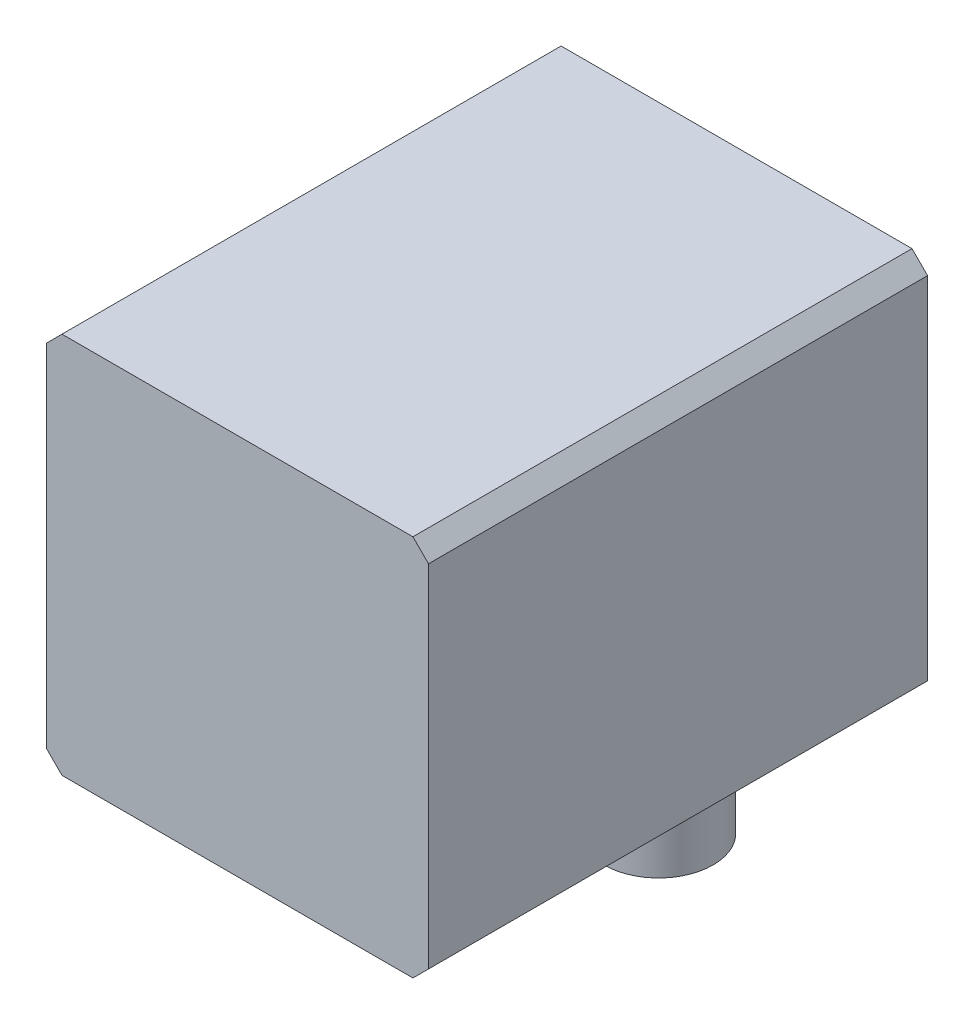
ISO-10303-21;
HEADER;
FILE_DESCRIPTION(('STEP AP214'),'2;1');
FILE_NAME('part.step','',(''),(''),'','','');
FILE_SCHEMA(('AUTOMOTIVE_DESIGN { 1 0 10303 214 1 1 1 1 }'));
ENDSEC;
DATA;
#1=APPLICATION_CONTEXT('core data for automotive mechanical design processes');
#2=APPLICATION_PROTOCOL_DEFINITION('international standard','automotive_design',2000,#1);
#3=PRODUCT_CONTEXT('',#1,'mechanical');
#4=PRODUCT('Part','Part','',(#3));
#5=PRODUCT_RELATED_PRODUCT_CATEGORY('part','',(#4));
#6=PRODUCT_DEFINITION_FORMATION('','',#4);
#7=PRODUCT_DEFINITION_CONTEXT('part definition',#1,'design');
#8=PRODUCT_DEFINITION('design','',#6,#7);
#9=PRODUCT_DEFINITION_SHAPE('','',#8);
#10=(LENGTH_UNIT() NAMED_UNIT(*) SI_UNIT(.MILLI.,.METRE.));
#11=(NAMED_UNIT(*) PLANE_ANGLE_UNIT() SI_UNIT($,.RADIAN.));
#12=(NAMED_UNIT(*) SI_UNIT($,.STERADIAN.) SOLID_ANGLE_UNIT());
#13=UNCERTAINTY_MEASURE_WITH_UNIT(LENGTH_MEASURE(1.E-05),#10,'distance_accuracy_value','');
#14=(GEOMETRIC_REPRESENTATION_CONTEXT(3) GLOBAL_UNCERTAINTY_ASSIGNED_CONTEXT((#13)) GLOBAL_UNIT_ASSIGNED_CONTEXT((#10,
#11,#12)) REPRESENTATION_CONTEXT('',''));
#15=CARTESIAN_POINT('',(0.,0.,0.));
#16=DIRECTION('',(0.,0.,1.));
#17=DIRECTION('',(1.,0.,0.));
#18=AXIS2_PLACEMENT_3D('',#15,#16,#17);
#19=CARTESIAN_POINT('',(-61.25,61.25,160.));
#20=DIRECTION('',(1.,0.,0.));
#21=DIRECTION('',(0.,1.,0.));
#22=AXIS2_PLACEMENT_3D('',#19,#20,#21);
#23=PLANE('',#22);
#24=DIRECTION('',(0.,-1.,0.));
#25=VECTOR('',#24,1.);
#26=CARTESIAN_POINT('',(-61.25,61.25,160.));
#27=LINE('',#26,#25);
#28=CARTESIAN_POINT('',(-61.25,56.25,160.));
#29=VERTEX_POINT('',#28);
#30=CARTESIAN_POINT('',(-61.25,-56.25,160.));
#31=VERTEX_POINT('',#30);
#32=EDGE_CURVE('E132',#29,#31,#27,.T.);
#33=ORIENTED_EDGE('',*,*,#32,.F.);
#34=DIRECTION('',(0.,0.,-1.));
#35=VECTOR('',#34,1.);
#36=CARTESIAN_POINT('',(-61.25,56.25,160.));
#37=LINE('',#36,#35);
#38=CARTESIAN_POINT('',(-61.25,56.25,0.));
#39=VERTEX_POINT('',#38);
#40=EDGE_CURVE('E11',#29,#39,#37,.T.);
#41=ORIENTED_EDGE('',*,*,#40,.T.);
#42=DIRECTION('',(0.,-1.,0.));
#43=VECTOR('',#42,1.);
#44=CARTESIAN_POINT('',(-61.25,61.25,0.));
#45=LINE('',#44,#43);
#46=CARTESIAN_POINT('',(-61.25,-56.25,0.));
#47=VERTEX_POINT('',#46);
#48=EDGE_CURVE('E167',#39,#47,#45,.T.);
#49=ORIENTED_EDGE('',*,*,#48,.T.);
#50=DIRECTION('',(0.,0.,1.));
#51=VECTOR('',#50,1.);
#52=CARTESIAN_POINT('',(-61.25,-56.25,160.));
#53=LINE('',#52,#51);
#54=EDGE_CURVE('E46',#47,#31,#53,.T.);
#55=ORIENTED_EDGE('',*,*,#54,.T.);
#56=EDGE_LOOP('',(#33,#41,#49,#55));
#57=FACE_BOUND('',#56,.T.);
#58=ADVANCED_FACE('F37',(#57),#23,.F.);
#59=CARTESIAN_POINT('',(-61.25,-61.25,160.));
#60=DIRECTION('',(0.,1.,0.));
#61=DIRECTION('',(0.,0.,1.));
#62=AXIS2_PLACEMENT_3D('',#59,#60,#61);
#63=PLANE('',#62);
#64=CARTESIAN_POINT('',(0.,-61.25,25.));
#65=DIRECTION('',(0.,1.,0.));
#66=DIRECTION('',(0.,0.,1.));
#67=AXIS2_PLACEMENT_3D('',#64,#65,#66);
#68=CIRCLE('',#67,17.5);
#69=CARTESIAN_POINT('',(0.,-61.25,42.5));
#70=VERTEX_POINT('',#69);
#71=EDGE_CURVE('E141',#70,#70,#68,.F.);
#72=ORIENTED_EDGE('',*,*,#71,.F.);
#73=EDGE_LOOP('',(#72));
#74=FACE_BOUND('',#73,.T.);
#75=DIRECTION('',(1.,0.,0.));
#76=VECTOR('',#75,1.);
#77=CARTESIAN_POINT('',(-61.25,-61.25,0.));
#78=LINE('',#77,#76);
#79=CARTESIAN_POINT('',(-56.25,-61.25,0.));
#80=VERTEX_POINT('',#79);
#81=CARTESIAN_POINT('',(56.25,-61.25,0.));
#82=VERTEX_POINT('',#81);
#83=EDGE_CURVE('E137',#80,#82,#78,.T.);
#84=ORIENTED_EDGE('',*,*,#83,.T.);
#85=DIRECTION('',(0.,0.,1.));
#86=VECTOR('',#85,1.);
#87=CARTESIAN_POINT('',(56.25,-61.25,160.));
#88=LINE('',#87,#86);
#89=CARTESIAN_POINT('',(56.25,-61.25,160.));
#90=VERTEX_POINT('',#89);
#91=EDGE_CURVE('E53',#82,#90,#88,.T.);
#92=ORIENTED_EDGE('',*,*,#91,.T.);
#93=DIRECTION('',(1.,0.,0.));
#94=VECTOR('',#93,1.);
#95=CARTESIAN_POINT('',(-61.25,-61.25,160.));
#96=LINE('',#95,#94);
#97=CARTESIAN_POINT('',(-56.25,-61.25,160.));
#98=VERTEX_POINT('',#97);
#99=EDGE_CURVE('E135',#98,#90,#96,.T.);
#100=ORIENTED_EDGE('',*,*,#99,.F.);
#101=DIRECTION('',(0.,0.,-1.));
#102=VECTOR('',#101,1.);
#103=CARTESIAN_POINT('',(-56.25,-61.25,160.));
#104=LINE('',#103,#102);
#105=EDGE_CURVE('E159',#98,#80,#104,.T.);
#106=ORIENTED_EDGE('',*,*,#105,.T.);
#107=EDGE_LOOP('',(#84,#92,#100,#106));
#108=FACE_BOUND('',#107,.T.);
#109=ADVANCED_FACE('F174',(#74,#108),#63,.F.);
#110=CARTESIAN_POINT('',(61.25,61.25,160.));
#111=DIRECTION('',(-1.,0.,0.));
#112=DIRECTION('',(0.,-1.,0.));
#113=AXIS2_PLACEMENT_3D('',#110,#111,#112);
#114=PLANE('',#113);
#115=DIRECTION('',(0.,1.,0.));
#116=VECTOR('',#115,1.);
#117=CARTESIAN_POINT('',(61.25,61.25,0.));
#118=LINE('',#117,#116);
#119=CARTESIAN_POINT('',(61.25,-56.25,0.));
#120=VERTEX_POINT('',#119);
#121=CARTESIAN_POINT('',(61.25,56.25,0.));
#122=VERTEX_POINT('',#121);
#123=EDGE_CURVE('E133',#120,#122,#118,.T.);
#124=ORIENTED_EDGE('',*,*,#123,.T.);
#125=DIRECTION('',(0.,0.,1.));
#126=VECTOR('',#125,1.);
#127=CARTESIAN_POINT('',(61.25,56.25,160.));
#128=LINE('',#127,#126);
#129=CARTESIAN_POINT('',(61.25,56.25,160.));
#130=VERTEX_POINT('',#129);
#131=EDGE_CURVE('E110',#122,#130,#128,.T.);
#132=ORIENTED_EDGE('',*,*,#131,.T.);
#133=DIRECTION('',(0.,1.,0.));
#134=VECTOR('',#133,1.);
#135=CARTESIAN_POINT('',(61.25,61.25,160.));
#136=LINE('',#135,#134);
#137=CARTESIAN_POINT('',(61.25,-56.25,160.));
#138=VERTEX_POINT('',#137);
#139=EDGE_CURVE('E179',#138,#130,#136,.T.);
#140=ORIENTED_EDGE('',*,*,#139,.F.);
#141=DIRECTION('',(0.,0.,-1.));
#142=VECTOR('',#141,1.);
#143=CARTESIAN_POINT('',(61.25,-56.25,160.));
#144=LINE('',#143,#142);
#145=EDGE_CURVE('E115',#138,#120,#144,.T.);
#146=ORIENTED_EDGE('',*,*,#145,.T.);
#147=EDGE_LOOP('',(#124,#132,#140,#146));
#148=FACE_BOUND('',#147,.T.);
#149=ADVANCED_FACE('F248',(#148),#114,.F.);
#150=CARTESIAN_POINT('',(-61.25,61.25,160.));
#151=DIRECTION('',(0.,-1.,0.));
#152=DIRECTION('',(0.,0.,-1.));
#153=AXIS2_PLACEMENT_3D('',#150,#151,#152);
#154=PLANE('',#153);
#155=DIRECTION('',(-1.,0.,0.));
#156=VECTOR('',#155,1.);
#157=CARTESIAN_POINT('',(-61.25,61.25,160.));
#158=LINE('',#157,#156);
#159=CARTESIAN_POINT('',(56.25,61.25,160.));
#160=VERTEX_POINT('',#159);
#161=CARTESIAN_POINT('',(-56.2499999999999,61.25,160.));
#162=VERTEX_POINT('',#161);
#163=EDGE_CURVE('E125',#160,#162,#158,.T.);
#164=ORIENTED_EDGE('',*,*,#163,.F.);
#165=DIRECTION('',(0.,0.,-1.));
#166=VECTOR('',#165,1.);
#167=CARTESIAN_POINT('',(56.25,61.25,160.));
#168=LINE('',#167,#166);
#169=CARTESIAN_POINT('',(56.25,61.25,0.));
#170=VERTEX_POINT('',#169);
#171=EDGE_CURVE('E109',#160,#170,#168,.T.);
#172=ORIENTED_EDGE('',*,*,#171,.T.);
#173=DIRECTION('',(-1.,0.,0.));
#174=VECTOR('',#173,1.);
#175=CARTESIAN_POINT('',(-61.25,61.25,0.));
#176=LINE('',#175,#174);
#177=CARTESIAN_POINT('',(-56.2499999999999,61.25,0.));
#178=VERTEX_POINT('',#177);
#179=EDGE_CURVE('E122',#170,#178,#176,.T.);
#180=ORIENTED_EDGE('',*,*,#179,.T.);
#181=DIRECTION('',(0.,0.,1.));
#182=VECTOR('',#181,1.);
#183=CARTESIAN_POINT('',(-56.2499999999999,61.25,160.));
#184=LINE('',#183,#182);
#185=EDGE_CURVE('E127',#178,#162,#184,.T.);
#186=ORIENTED_EDGE('',*,*,#185,.T.);
#187=EDGE_LOOP('',(#164,#172,#180,#186));
#188=FACE_BOUND('',#187,.T.);
#189=ADVANCED_FACE('F121',(#188),#154,.F.);
#190=CARTESIAN_POINT('',(0.,0.,160.));
#191=DIRECTION('',(0.,0.,1.));
#192=DIRECTION('',(1.,0.,0.));
#193=AXIS2_PLACEMENT_3D('',#190,#191,#192);
#194=PLANE('',#193);
#195=ORIENTED_EDGE('',*,*,#139,.T.);
#196=DIRECTION('',(0.707106781186546,-0.707106781186549,0.));
#197=VECTOR('',#196,1.);
#198=CARTESIAN_POINT('',(58.7500000000001,58.7499999999998,160.));
#199=LINE('',#198,#197);
#200=EDGE_CURVE('E157',#130,#160,#199,.F.);
#201=ORIENTED_EDGE('',*,*,#200,.T.);
#202=ORIENTED_EDGE('',*,*,#163,.T.);
#203=DIRECTION('',(0.707106781186549,0.707106781186546,0.));
#204=VECTOR('',#203,1.);
#205=CARTESIAN_POINT('',(-58.7499999999998,58.7500000000001,160.));
#206=LINE('',#205,#204);
#207=EDGE_CURVE('E153',#162,#29,#206,.F.);
#208=ORIENTED_EDGE('',*,*,#207,.T.);
#209=ORIENTED_EDGE('',*,*,#32,.T.);
#210=DIRECTION('',(-0.707106781186546,0.707106781186549,0.));
#211=VECTOR('',#210,1.);
#212=CARTESIAN_POINT('',(-58.7500000000001,-58.7499999999999,160.));
#213=LINE('',#212,#211);
#214=EDGE_CURVE('E60',#31,#98,#213,.F.);
#215=ORIENTED_EDGE('',*,*,#214,.T.);
#216=ORIENTED_EDGE('',*,*,#99,.T.);
#217=DIRECTION('',(-0.70710678118655,-0.707106781186545,0.));
#218=VECTOR('',#217,1.);
#219=CARTESIAN_POINT('',(58.7499999999998,-58.7500000000002,160.));
#220=LINE('',#219,#218);
#221=EDGE_CURVE('E155',#90,#138,#220,.F.);
#222=ORIENTED_EDGE('',*,*,#221,.T.);
#223=EDGE_LOOP('',(#195,#201,#202,#208,#209,#215,#216,#222));
#224=FACE_BOUND('',#223,.T.);
#225=ADVANCED_FACE('F170',(#224),#194,.T.);
#226=CARTESIAN_POINT('',(0.,0.,0.));
#227=DIRECTION('',(0.,0.,1.));
#228=DIRECTION('',(1.,0.,0.));
#229=AXIS2_PLACEMENT_3D('',#226,#227,#228);
#230=PLANE('',#229);
#231=CARTESIAN_POINT('',(48.,-48.,0.));
#232=DIRECTION('',(0.,0.,-1.));
#233=DIRECTION('',(-1.,0.,0.));
#234=AXIS2_PLACEMENT_3D('',#231,#232,#233);
#235=CIRCLE('',#234,2.75);
#236=CARTESIAN_POINT('',(45.25,-48.,0.));
#237=VERTEX_POINT('',#236);
#238=EDGE_CURVE('E196',#237,#237,#235,.T.);
#239=ORIENTED_EDGE('',*,*,#238,.F.);
#240=EDGE_LOOP('',(#239));
#241=FACE_BOUND('',#240,.T.);
#242=CARTESIAN_POINT('',(-48.,-48.,0.));
#243=DIRECTION('',(0.,0.,-1.));
#244=DIRECTION('',(-1.,0.,0.));
#245=AXIS2_PLACEMENT_3D('',#242,#243,#244);
#246=CIRCLE('',#245,2.75);
#247=CARTESIAN_POINT('',(-50.75,-48.,0.));
#248=VERTEX_POINT('',#247);
#249=EDGE_CURVE('E202',#248,#248,#246,.T.);
#250=ORIENTED_EDGE('',*,*,#249,.F.);
#251=EDGE_LOOP('',(#250));
#252=FACE_BOUND('',#251,.T.);
#253=CARTESIAN_POINT('',(-48.,48.,0.));
#254=DIRECTION('',(0.,0.,-1.));
#255=DIRECTION('',(-1.,0.,0.));
#256=AXIS2_PLACEMENT_3D('',#253,#254,#255);
#257=CIRCLE('',#256,2.75);
#258=CARTESIAN_POINT('',(-50.75,48.,0.));
#259=VERTEX_POINT('',#258);
#260=EDGE_CURVE('E208',#259,#259,#257,.T.);
#261=ORIENTED_EDGE('',*,*,#260,.F.);
#262=EDGE_LOOP('',(#261));
#263=FACE_BOUND('',#262,.T.);
#264=CARTESIAN_POINT('',(48.,48.,0.));
#265=DIRECTION('',(0.,0.,-1.));
#266=DIRECTION('',(-1.,0.,0.));
#267=AXIS2_PLACEMENT_3D('',#264,#265,#266);
#268=CIRCLE('',#267,2.75);
#269=CARTESIAN_POINT('',(45.25,48.,0.));
#270=VERTEX_POINT('',#269);
#271=EDGE_CURVE('E190',#270,#270,#268,.T.);
#272=ORIENTED_EDGE('',*,*,#271,.F.);
#273=EDGE_LOOP('',(#272));
#274=FACE_BOUND('',#273,.T.);
#275=ORIENTED_EDGE('',*,*,#179,.F.);
#276=DIRECTION('',(-0.707106781186546,0.707106781186549,0.));
#277=VECTOR('',#276,1.);
#278=CARTESIAN_POINT('',(56.25,61.25,0.));
#279=LINE('',#278,#277);
#280=EDGE_CURVE('E105',#170,#122,#279,.F.);
#281=ORIENTED_EDGE('',*,*,#280,.T.);
#282=ORIENTED_EDGE('',*,*,#123,.F.);
#283=DIRECTION('',(0.70710678118655,0.707106781186545,0.));
#284=VECTOR('',#283,1.);
#285=CARTESIAN_POINT('',(61.25,-56.25,0.));
#286=LINE('',#285,#284);
#287=EDGE_CURVE('E116',#120,#82,#286,.F.);
#288=ORIENTED_EDGE('',*,*,#287,.T.);
#289=ORIENTED_EDGE('',*,*,#83,.F.);
#290=DIRECTION('',(0.707106781186546,-0.707106781186549,0.));
#291=VECTOR('',#290,1.);
#292=CARTESIAN_POINT('',(-56.25,-61.25,0.));
#293=LINE('',#292,#291);
#294=EDGE_CURVE('E126',#80,#47,#293,.F.);
#295=ORIENTED_EDGE('',*,*,#294,.T.);
#296=ORIENTED_EDGE('',*,*,#48,.F.);
#297=DIRECTION('',(-0.707106781186549,-0.707106781186546,0.));
#298=VECTOR('',#297,1.);
#299=CARTESIAN_POINT('',(-61.25,56.25,0.));
#300=LINE('',#299,#298);
#301=EDGE_CURVE('E131',#39,#178,#300,.F.);
#302=ORIENTED_EDGE('',*,*,#301,.T.);
#303=EDGE_LOOP('',(#275,#281,#282,#288,#289,#295,#296,#302));
#304=FACE_BOUND('',#303,.T.);
#305=ADVANCED_FACE('F129',(#241,#252,#263,#274,#304),#230,.F.);
#306=CARTESIAN_POINT('',(0.,-116.75,25.));
#307=DIRECTION('',(0.,1.,0.));
#308=DIRECTION('',(0.,0.,1.));
#309=AXIS2_PLACEMENT_3D('',#306,#307,#308);
#310=CYLINDRICAL_SURFACE('',#309,17.5);
#311=CARTESIAN_POINT('',(0.,-116.75,25.));
#312=DIRECTION('',(0.,-1.,0.));
#313=DIRECTION('',(0.,0.,-1.));
#314=AXIS2_PLACEMENT_3D('',#311,#312,#313);
#315=CIRCLE('',#314,17.5);
#316=CARTESIAN_POINT('',(0.,-116.75,7.5));
#317=VERTEX_POINT('',#316);
#318=EDGE_CURVE('E175',#317,#317,#315,.T.);
#319=ORIENTED_EDGE('',*,*,#318,.F.);
#320=EDGE_LOOP('',(#319));
#321=FACE_BOUND('',#320,.T.);
#322=ORIENTED_EDGE('',*,*,#71,.T.);
#323=EDGE_LOOP('',(#322));
#324=FACE_BOUND('',#323,.T.);
#325=ADVANCED_FACE('F225',(#321,#324),#310,.T.);
#326=CARTESIAN_POINT('',(0.,-116.75,25.));
#327=DIRECTION('',(0.,-1.,0.));
#328=DIRECTION('',(0.,0.,-1.));
#329=AXIS2_PLACEMENT_3D('',#326,#327,#328);
#330=PLANE('',#329);
#331=CARTESIAN_POINT('',(0.,-116.75,25.));
#332=DIRECTION('',(0.,-1.,0.));
#333=DIRECTION('',(0.,0.,-1.));
#334=AXIS2_PLACEMENT_3D('',#331,#332,#333);
#335=CIRCLE('',#334,6.);
#336=CARTESIAN_POINT('',(0.,-116.75,19.));
#337=VERTEX_POINT('',#336);
#338=EDGE_CURVE('E144',#337,#337,#335,.T.);
#339=ORIENTED_EDGE('',*,*,#338,.F.);
#340=EDGE_LOOP('',(#339));
#341=FACE_BOUND('',#340,.T.);
#342=ORIENTED_EDGE('',*,*,#318,.T.);
#343=EDGE_LOOP('',(#342));
#344=FACE_BOUND('',#343,.T.);
#345=ADVANCED_FACE('F286',(#341,#344),#330,.T.);
#346=CARTESIAN_POINT('',(0.,-121.75,25.));
#347=DIRECTION('',(0.,1.,0.));
#348=DIRECTION('',(0.,0.,1.));
#349=AXIS2_PLACEMENT_3D('',#346,#347,#348);
#350=CYLINDRICAL_SURFACE('',#349,6.);
#351=CARTESIAN_POINT('',(0.,-121.75,25.));
#352=DIRECTION('',(0.,-1.,0.));
#353=DIRECTION('',(0.,0.,-1.));
#354=AXIS2_PLACEMENT_3D('',#351,#352,#353);
#355=CIRCLE('',#354,6.);
#356=CARTESIAN_POINT('',(0.,-121.75,19.));
#357=VERTEX_POINT('',#356);
#358=EDGE_CURVE('E184',#357,#357,#355,.T.);
#359=ORIENTED_EDGE('',*,*,#358,.F.);
#360=EDGE_LOOP('',(#359));
#361=FACE_BOUND('',#360,.T.);
#362=ORIENTED_EDGE('',*,*,#338,.T.);
#363=EDGE_LOOP('',(#362));
#364=FACE_BOUND('',#363,.T.);
#365=ADVANCED_FACE('F290',(#361,#364),#350,.T.);
#366=CARTESIAN_POINT('',(0.,-121.75,25.));
#367=DIRECTION('',(0.,-1.,0.));
#368=DIRECTION('',(0.,0.,-1.));
#369=AXIS2_PLACEMENT_3D('',#366,#367,#368);
#370=PLANE('',#369);
#371=ORIENTED_EDGE('',*,*,#358,.T.);
#372=EDGE_LOOP('',(#371));
#373=FACE_BOUND('',#372,.T.);
#374=ADVANCED_FACE('F260',(#373),#370,.T.);
#375=CARTESIAN_POINT('',(56.25,61.25,160.));
#376=DIRECTION('',(-0.707106781186549,-0.707106781186545,0.));
#377=DIRECTION('',(0.,0.,-1.));
#378=AXIS2_PLACEMENT_3D('',#375,#376,#377);
#379=PLANE('',#378);
#380=ORIENTED_EDGE('',*,*,#200,.F.);
#381=ORIENTED_EDGE('',*,*,#131,.F.);
#382=ORIENTED_EDGE('',*,*,#280,.F.);
#383=ORIENTED_EDGE('',*,*,#171,.F.);
#384=EDGE_LOOP('',(#380,#381,#382,#383));
#385=FACE_BOUND('',#384,.T.);
#386=ADVANCED_FACE('F108',(#385),#379,.F.);
#387=CARTESIAN_POINT('',(61.25,-56.25,160.));
#388=DIRECTION('',(-0.707106781186545,0.70710678118655,0.));
#389=DIRECTION('',(0.,0.,-1.));
#390=AXIS2_PLACEMENT_3D('',#387,#388,#389);
#391=PLANE('',#390);
#392=ORIENTED_EDGE('',*,*,#221,.F.);
#393=ORIENTED_EDGE('',*,*,#91,.F.);
#394=ORIENTED_EDGE('',*,*,#287,.F.);
#395=ORIENTED_EDGE('',*,*,#145,.F.);
#396=EDGE_LOOP('',(#392,#393,#394,#395));
#397=FACE_BOUND('',#396,.T.);
#398=ADVANCED_FACE('F259',(#397),#391,.F.);
#399=CARTESIAN_POINT('',(-61.25,56.25,160.));
#400=DIRECTION('',(0.707106781186546,-0.707106781186549,0.));
#401=DIRECTION('',(0.,0.,-1.));
#402=AXIS2_PLACEMENT_3D('',#399,#400,#401);
#403=PLANE('',#402);
#404=ORIENTED_EDGE('',*,*,#207,.F.);
#405=ORIENTED_EDGE('',*,*,#185,.F.);
#406=ORIENTED_EDGE('',*,*,#301,.F.);
#407=ORIENTED_EDGE('',*,*,#40,.F.);
#408=EDGE_LOOP('',(#404,#405,#406,#407));
#409=FACE_BOUND('',#408,.T.);
#410=ADVANCED_FACE('F240',(#409),#403,.F.);
#411=CARTESIAN_POINT('',(-56.25,-61.25,160.));
#412=DIRECTION('',(0.707106781186549,0.707106781186546,0.));
#413=DIRECTION('',(0.,0.,-1.));
#414=AXIS2_PLACEMENT_3D('',#411,#412,#413);
#415=PLANE('',#414);
#416=ORIENTED_EDGE('',*,*,#214,.F.);
#417=ORIENTED_EDGE('',*,*,#54,.F.);
#418=ORIENTED_EDGE('',*,*,#294,.F.);
#419=ORIENTED_EDGE('',*,*,#105,.F.);
#420=EDGE_LOOP('',(#416,#417,#418,#419));
#421=FACE_BOUND('',#420,.T.);
#422=ADVANCED_FACE('F40',(#421),#415,.F.);
#423=CARTESIAN_POINT('',(48.,48.,20.));
#424=DIRECTION('',(0.,0.,-1.));
#425=DIRECTION('',(-1.,0.,0.));
#426=AXIS2_PLACEMENT_3D('',#423,#424,#425);
#427=CYLINDRICAL_SURFACE('',#426,2.75);
#428=CARTESIAN_POINT('',(48.,48.,20.));
#429=DIRECTION('',(0.,0.,-1.));
#430=DIRECTION('',(-1.,0.,0.));
#431=AXIS2_PLACEMENT_3D('',#428,#429,#430);
#432=CIRCLE('',#431,2.75);
#433=CARTESIAN_POINT('',(45.25,48.,20.));
#434=VERTEX_POINT('',#433);
#435=EDGE_CURVE('E189',#434,#434,#432,.T.);
#436=ORIENTED_EDGE('',*,*,#435,.F.);
#437=EDGE_LOOP('',(#436));
#438=FACE_BOUND('',#437,.T.);
#439=ORIENTED_EDGE('',*,*,#271,.T.);
#440=EDGE_LOOP('',(#439));
#441=FACE_BOUND('',#440,.T.);
#442=ADVANCED_FACE('F230',(#438,#441),#427,.F.);
#443=CARTESIAN_POINT('',(48.,48.,20.));
#444=DIRECTION('',(0.,0.,-1.));
#445=DIRECTION('',(-1.,0.,0.));
#446=AXIS2_PLACEMENT_3D('',#443,#444,#445);
#447=PLANE('',#446);
#448=ORIENTED_EDGE('',*,*,#435,.T.);
#449=EDGE_LOOP('',(#448));
#450=FACE_BOUND('',#449,.T.);
#451=ADVANCED_FACE('F219',(#450),#447,.T.);
#452=CARTESIAN_POINT('',(-48.,48.,20.));
#453=DIRECTION('',(0.,0.,-1.));
#454=DIRECTION('',(-1.,0.,0.));
#455=AXIS2_PLACEMENT_3D('',#452,#453,#454);
#456=CYLINDRICAL_SURFACE('',#455,2.75);
#457=CARTESIAN_POINT('',(-48.,48.,20.));
#458=DIRECTION('',(0.,0.,-1.));
#459=DIRECTION('',(-1.,0.,0.));
#460=AXIS2_PLACEMENT_3D('',#457,#458,#459);
#461=CIRCLE('',#460,2.75);
#462=CARTESIAN_POINT('',(-50.75,48.,20.));
#463=VERTEX_POINT('',#462);
#464=EDGE_CURVE('E193',#463,#463,#461,.T.);
#465=ORIENTED_EDGE('',*,*,#464,.F.);
#466=EDGE_LOOP('',(#465));
#467=FACE_BOUND('',#466,.T.);
#468=ORIENTED_EDGE('',*,*,#260,.T.);
#469=EDGE_LOOP('',(#468));
#470=FACE_BOUND('',#469,.T.);
#471=ADVANCED_FACE('F216',(#467,#470),#456,.F.);
#472=CARTESIAN_POINT('',(-48.,48.,20.));
#473=DIRECTION('',(0.,0.,-1.));
#474=DIRECTION('',(-1.,0.,0.));
#475=AXIS2_PLACEMENT_3D('',#472,#473,#474);
#476=PLANE('',#475);
#477=ORIENTED_EDGE('',*,*,#464,.T.);
#478=EDGE_LOOP('',(#477));
#479=FACE_BOUND('',#478,.T.);
#480=ADVANCED_FACE('F214',(#479),#476,.T.);
#481=CARTESIAN_POINT('',(-48.,-48.,20.));
#482=DIRECTION('',(0.,0.,-1.));
#483=DIRECTION('',(-1.,0.,0.));
#484=AXIS2_PLACEMENT_3D('',#481,#482,#483);
#485=CYLINDRICAL_SURFACE('',#484,2.75);
#486=CARTESIAN_POINT('',(-48.,-48.,20.));
#487=DIRECTION('',(0.,0.,-1.));
#488=DIRECTION('',(-1.,0.,0.));
#489=AXIS2_PLACEMENT_3D('',#486,#487,#488);
#490=CIRCLE('',#489,2.75);
#491=CARTESIAN_POINT('',(-50.75,-48.,20.));
#492=VERTEX_POINT('',#491);
#493=EDGE_CURVE('E205',#492,#492,#490,.T.);
#494=ORIENTED_EDGE('',*,*,#493,.F.);
#495=EDGE_LOOP('',(#494));
#496=FACE_BOUND('',#495,.T.);
#497=ORIENTED_EDGE('',*,*,#249,.T.);
#498=EDGE_LOOP('',(#497));
#499=FACE_BOUND('',#498,.T.);
#500=ADVANCED_FACE('F359',(#496,#499),#485,.F.);
#501=CARTESIAN_POINT('',(-48.,-48.,20.));
#502=DIRECTION('',(0.,0.,-1.));
#503=DIRECTION('',(-1.,0.,0.));
#504=AXIS2_PLACEMENT_3D('',#501,#502,#503);
#505=PLANE('',#504);
#506=ORIENTED_EDGE('',*,*,#493,.T.);
#507=EDGE_LOOP('',(#506));
#508=FACE_BOUND('',#507,.T.);
#509=ADVANCED_FACE('F368',(#508),#505,.T.);
#510=CARTESIAN_POINT('',(48.,-48.,20.));
#511=DIRECTION('',(0.,0.,-1.));
#512=DIRECTION('',(-1.,0.,0.));
#513=AXIS2_PLACEMENT_3D('',#510,#511,#512);
#514=CYLINDRICAL_SURFACE('',#513,2.75);
#515=CARTESIAN_POINT('',(48.,-48.,20.));
#516=DIRECTION('',(0.,0.,-1.));
#517=DIRECTION('',(-1.,0.,0.));
#518=AXIS2_PLACEMENT_3D('',#515,#516,#517);
#519=CIRCLE('',#518,2.75);
#520=CARTESIAN_POINT('',(45.25,-48.,20.));
#521=VERTEX_POINT('',#520);
#522=EDGE_CURVE('E199',#521,#521,#519,.T.);
#523=ORIENTED_EDGE('',*,*,#522,.F.);
#524=EDGE_LOOP('',(#523));
#525=FACE_BOUND('',#524,.T.);
#526=ORIENTED_EDGE('',*,*,#238,.T.);
#527=EDGE_LOOP('',(#526));
#528=FACE_BOUND('',#527,.T.);
#529=ADVANCED_FACE('F378',(#525,#528),#514,.F.);
#530=CARTESIAN_POINT('',(48.,-48.,20.));
#531=DIRECTION('',(0.,0.,-1.));
#532=DIRECTION('',(-1.,0.,0.));
#533=AXIS2_PLACEMENT_3D('',#530,#531,#532);
#534=PLANE('',#533);
#535=ORIENTED_EDGE('',*,*,#522,.T.);
#536=EDGE_LOOP('',(#535));
#537=FACE_BOUND('',#536,.T.);
#538=ADVANCED_FACE('F388',(#537),#534,.T.);
#539=CLOSED_SHELL('',(#58,#109,#149,#189,#225,#305,#325,#345,#365,#374,#386,#398,#410,#422,#442,
#451,#471,#480,#500,#509,#529,#538));
#540=MANIFOLD_SOLID_BREP('B2',#539);
#541=ADVANCED_BREP_SHAPE_REPRESENTATION('',(#18,#540),#14);
#542=SHAPE_DEFINITION_REPRESENTATION(#9,#541);
ENDSEC;
END-ISO-10303-21;
